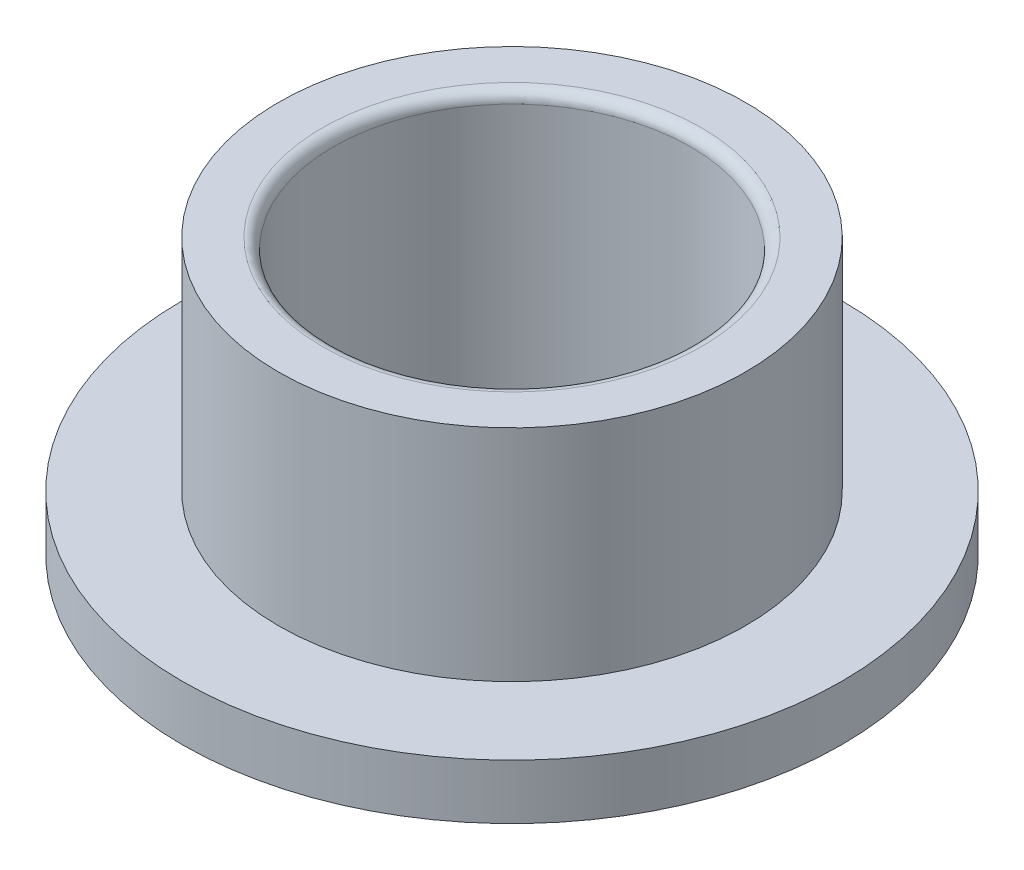
ISO-10303-21;
HEADER;
FILE_DESCRIPTION(('STEP AP214'),'2;1');
FILE_NAME('part.step','',(''),(''),'','','');
FILE_SCHEMA(('AUTOMOTIVE_DESIGN { 1 0 10303 214 1 1 1 1 }'));
ENDSEC;
DATA;
#1=APPLICATION_CONTEXT('core data for automotive mechanical design processes');
#2=APPLICATION_PROTOCOL_DEFINITION('international standard','automotive_design',2000,#1);
#3=PRODUCT_CONTEXT('',#1,'mechanical');
#4=PRODUCT('Part','Part','',(#3));
#5=PRODUCT_RELATED_PRODUCT_CATEGORY('part','',(#4));
#6=PRODUCT_DEFINITION_FORMATION('','',#4);
#7=PRODUCT_DEFINITION_CONTEXT('part definition',#1,'design');
#8=PRODUCT_DEFINITION('design','',#6,#7);
#9=PRODUCT_DEFINITION_SHAPE('','',#8);
#10=(LENGTH_UNIT() NAMED_UNIT(*) SI_UNIT(.MILLI.,.METRE.));
#11=(NAMED_UNIT(*) PLANE_ANGLE_UNIT() SI_UNIT($,.RADIAN.));
#12=(NAMED_UNIT(*) SI_UNIT($,.STERADIAN.) SOLID_ANGLE_UNIT());
#13=UNCERTAINTY_MEASURE_WITH_UNIT(LENGTH_MEASURE(1.E-05),#10,'distance_accuracy_value','');
#14=(GEOMETRIC_REPRESENTATION_CONTEXT(3) GLOBAL_UNCERTAINTY_ASSIGNED_CONTEXT((#13)) GLOBAL_UNIT_ASSIGNED_CONTEXT((#10,
#11,#12)) REPRESENTATION_CONTEXT('',''));
#15=CARTESIAN_POINT('',(0.,0.,0.));
#16=DIRECTION('',(0.,0.,1.));
#17=DIRECTION('',(1.,0.,0.));
#18=AXIS2_PLACEMENT_3D('',#15,#16,#17);
#19=CARTESIAN_POINT('',(0.,20.,0.));
#20=DIRECTION('',(0.,1.,0.));
#21=DIRECTION('',(0.,0.,1.));
#22=AXIS2_PLACEMENT_3D('',#19,#20,#21);
#23=PLANE('',#22);
#24=CARTESIAN_POINT('',(0.,20.,0.));
#25=DIRECTION('',(0.,1.,0.));
#26=DIRECTION('',(0.,0.,1.));
#27=AXIS2_PLACEMENT_3D('',#24,#25,#26);
#28=CIRCLE('',#27,17.25);
#29=CARTESIAN_POINT('',(0.,20.,17.25));
#30=VERTEX_POINT('',#29);
#31=EDGE_CURVE('E41',#30,#30,#28,.F.);
#32=ORIENTED_EDGE('',*,*,#31,.T.);
#33=EDGE_LOOP('',(#32));
#34=FACE_BOUND('',#33,.T.);
#35=CARTESIAN_POINT('',(0.,20.,0.));
#36=DIRECTION('',(0.,1.,0.));
#37=DIRECTION('',(0.,0.,1.));
#38=AXIS2_PLACEMENT_3D('',#35,#36,#37);
#39=CIRCLE('',#38,21.25);
#40=CARTESIAN_POINT('',(0.,20.,21.25));
#41=VERTEX_POINT('',#40);
#42=EDGE_CURVE('E50',#41,#41,#39,.T.);
#43=ORIENTED_EDGE('',*,*,#42,.T.);
#44=EDGE_LOOP('',(#43));
#45=FACE_BOUND('',#44,.T.);
#46=ADVANCED_FACE('F30',(#34,#45),#23,.T.);
#47=CARTESIAN_POINT('',(0.,20.,0.));
#48=DIRECTION('',(0.,-1.,0.));
#49=DIRECTION('',(0.,0.,-1.));
#50=AXIS2_PLACEMENT_3D('',#47,#48,#49);
#51=CYLINDRICAL_SURFACE('',#50,21.25);
#52=ORIENTED_EDGE('',*,*,#42,.F.);
#53=EDGE_LOOP('',(#52));
#54=FACE_BOUND('',#53,.T.);
#55=CARTESIAN_POINT('',(0.,0.,0.));
#56=DIRECTION('',(0.,1.,0.));
#57=DIRECTION('',(0.,0.,1.));
#58=AXIS2_PLACEMENT_3D('',#55,#56,#57);
#59=CIRCLE('',#58,21.25);
#60=CARTESIAN_POINT('',(0.,0.,21.25));
#61=VERTEX_POINT('',#60);
#62=EDGE_CURVE('E51',#61,#61,#59,.T.);
#63=ORIENTED_EDGE('',*,*,#62,.T.);
#64=EDGE_LOOP('',(#63));
#65=FACE_BOUND('',#64,.T.);
#66=ADVANCED_FACE('F82',(#54,#65),#51,.T.);
#67=CARTESIAN_POINT('',(0.,20.,0.));
#68=DIRECTION('',(0.,-1.,0.));
#69=DIRECTION('',(0.,0.,-1.));
#70=AXIS2_PLACEMENT_3D('',#67,#68,#69);
#71=CYLINDRICAL_SURFACE('',#70,16.25);
#72=CARTESIAN_POINT('',(0.,-4.,0.));
#73=DIRECTION('',(0.,-1.,0.));
#74=DIRECTION('',(0.,0.,-1.));
#75=AXIS2_PLACEMENT_3D('',#72,#73,#74);
#76=CIRCLE('',#75,16.25);
#77=CARTESIAN_POINT('',(0.,-4.,-16.25));
#78=VERTEX_POINT('',#77);
#79=EDGE_CURVE('E37',#78,#78,#76,.T.);
#80=ORIENTED_EDGE('',*,*,#79,.T.);
#81=EDGE_LOOP('',(#80));
#82=FACE_BOUND('',#81,.T.);
#83=CARTESIAN_POINT('',(0.,19.,0.));
#84=DIRECTION('',(0.,1.,0.));
#85=DIRECTION('',(0.,0.,1.));
#86=AXIS2_PLACEMENT_3D('',#83,#84,#85);
#87=CIRCLE('',#86,16.25);
#88=CARTESIAN_POINT('',(0.,19.,16.25));
#89=VERTEX_POINT('',#88);
#90=EDGE_CURVE('E45',#89,#89,#87,.T.);
#91=ORIENTED_EDGE('',*,*,#90,.T.);
#92=EDGE_LOOP('',(#91));
#93=FACE_BOUND('',#92,.T.);
#94=ADVANCED_FACE('F88',(#82,#93),#71,.F.);
#95=CARTESIAN_POINT('',(0.,19.,0.));
#96=DIRECTION('',(0.,1.,0.));
#97=DIRECTION('',(0.,0.,1.));
#98=AXIS2_PLACEMENT_3D('',#95,#96,#97);
#99=TOROIDAL_SURFACE('',#98,17.25,1.);
#100=ORIENTED_EDGE('',*,*,#31,.F.);
#101=EDGE_LOOP('',(#100));
#102=FACE_BOUND('',#101,.T.);
#103=ORIENTED_EDGE('',*,*,#90,.F.);
#104=EDGE_LOOP('',(#103));
#105=FACE_BOUND('',#104,.T.);
#106=ADVANCED_FACE('F78',(#102,#105),#99,.T.);
#107=CARTESIAN_POINT('',(0.,-5.,0.));
#108=DIRECTION('',(0.,-1.,0.));
#109=DIRECTION('',(0.,0.,-1.));
#110=AXIS2_PLACEMENT_3D('',#107,#108,#109);
#111=PLANE('',#110);
#112=CARTESIAN_POINT('',(0.,-5.,0.));
#113=DIRECTION('',(0.,-1.,0.));
#114=DIRECTION('',(0.,0.,-1.));
#115=AXIS2_PLACEMENT_3D('',#112,#113,#114);
#116=CIRCLE('',#115,17.25);
#117=CARTESIAN_POINT('',(0.,-5.,-17.25));
#118=VERTEX_POINT('',#117);
#119=EDGE_CURVE('E10',#118,#118,#116,.F.);
#120=ORIENTED_EDGE('',*,*,#119,.T.);
#121=EDGE_LOOP('',(#120));
#122=FACE_BOUND('',#121,.T.);
#123=CARTESIAN_POINT('',(0.,-5.,0.));
#124=DIRECTION('',(0.,-1.,0.));
#125=DIRECTION('',(0.,0.,-1.));
#126=AXIS2_PLACEMENT_3D('',#123,#124,#125);
#127=CIRCLE('',#126,30.);
#128=CARTESIAN_POINT('',(0.,-5.,-30.));
#129=VERTEX_POINT('',#128);
#130=EDGE_CURVE('E54',#129,#129,#127,.T.);
#131=ORIENTED_EDGE('',*,*,#130,.T.);
#132=EDGE_LOOP('',(#131));
#133=FACE_BOUND('',#132,.T.);
#134=ADVANCED_FACE('F63',(#122,#133),#111,.T.);
#135=CARTESIAN_POINT('',(0.,0.,0.));
#136=DIRECTION('',(0.,-1.,0.));
#137=DIRECTION('',(0.,0.,-1.));
#138=AXIS2_PLACEMENT_3D('',#135,#136,#137);
#139=PLANE('',#138);
#140=ORIENTED_EDGE('',*,*,#62,.F.);
#141=EDGE_LOOP('',(#140));
#142=FACE_BOUND('',#141,.T.);
#143=CARTESIAN_POINT('',(0.,0.,0.));
#144=DIRECTION('',(0.,-1.,0.));
#145=DIRECTION('',(0.,0.,-1.));
#146=AXIS2_PLACEMENT_3D('',#143,#144,#145);
#147=CIRCLE('',#146,30.);
#148=CARTESIAN_POINT('',(0.,0.,-30.));
#149=VERTEX_POINT('',#148);
#150=EDGE_CURVE('E57',#149,#149,#147,.T.);
#151=ORIENTED_EDGE('',*,*,#150,.F.);
#152=EDGE_LOOP('',(#151));
#153=FACE_BOUND('',#152,.T.);
#154=ADVANCED_FACE('F68',(#142,#153),#139,.F.);
#155=CARTESIAN_POINT('',(0.,-5.,0.));
#156=DIRECTION('',(0.,1.,0.));
#157=DIRECTION('',(0.,0.,1.));
#158=AXIS2_PLACEMENT_3D('',#155,#156,#157);
#159=CYLINDRICAL_SURFACE('',#158,30.);
#160=ORIENTED_EDGE('',*,*,#130,.F.);
#161=EDGE_LOOP('',(#160));
#162=FACE_BOUND('',#161,.T.);
#163=ORIENTED_EDGE('',*,*,#150,.T.);
#164=EDGE_LOOP('',(#163));
#165=FACE_BOUND('',#164,.T.);
#166=ADVANCED_FACE('F65',(#162,#165),#159,.T.);
#167=CARTESIAN_POINT('',(0.,-4.,0.));
#168=DIRECTION('',(0.,-1.,0.));
#169=DIRECTION('',(0.,0.,-1.));
#170=AXIS2_PLACEMENT_3D('',#167,#168,#169);
#171=TOROIDAL_SURFACE('',#170,17.25,1.);
#172=ORIENTED_EDGE('',*,*,#119,.F.);
#173=EDGE_LOOP('',(#172));
#174=FACE_BOUND('',#173,.T.);
#175=ORIENTED_EDGE('',*,*,#79,.F.);
#176=EDGE_LOOP('',(#175));
#177=FACE_BOUND('',#176,.T.);
#178=ADVANCED_FACE('F32',(#174,#177),#171,.T.);
#179=CLOSED_SHELL('',(#46,#66,#94,#106,#134,#154,#166,#178));
#180=MANIFOLD_SOLID_BREP('B2',#179);
#181=ADVANCED_BREP_SHAPE_REPRESENTATION('',(#18,#180),#14);
#182=SHAPE_DEFINITION_REPRESENTATION(#9,#181);
ENDSEC;
END-ISO-10303-21;
